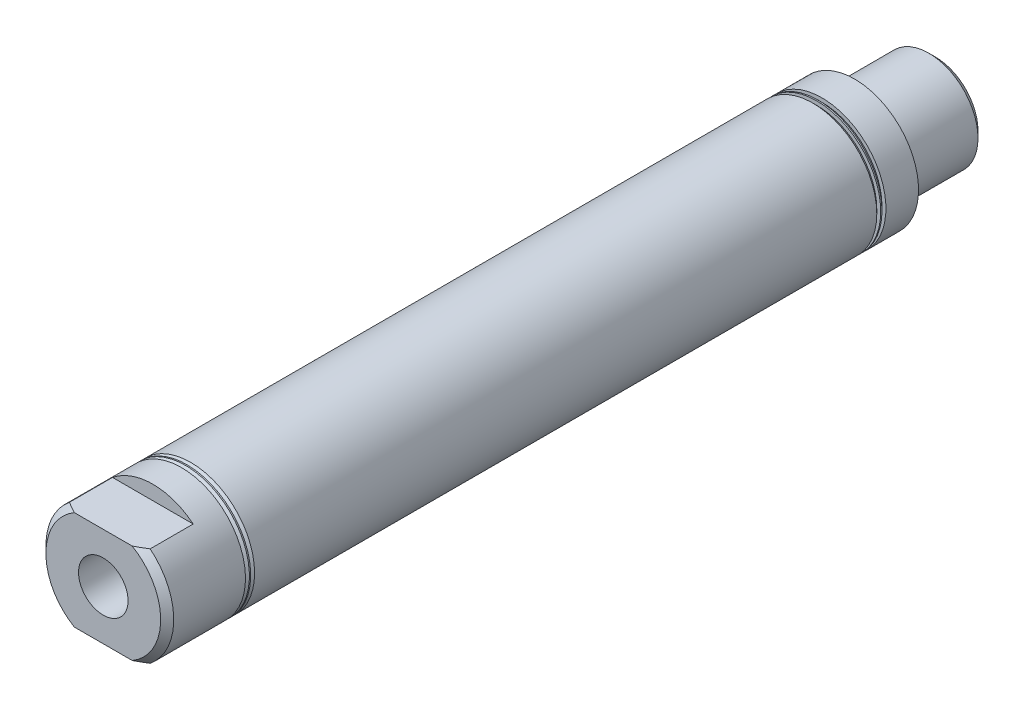
ISO-10303-21;
HEADER;
FILE_DESCRIPTION(('STEP AP214'),'2;1');
FILE_NAME('part.step','',(''),(''),'','','');
FILE_SCHEMA(('AUTOMOTIVE_DESIGN { 1 0 10303 214 1 1 1 1 }'));
ENDSEC;
DATA;
#1=APPLICATION_CONTEXT('core data for automotive mechanical design processes');
#2=APPLICATION_PROTOCOL_DEFINITION('international standard','automotive_design',2000,#1);
#3=PRODUCT_CONTEXT('',#1,'mechanical');
#4=PRODUCT('Part','Part','',(#3));
#5=PRODUCT_RELATED_PRODUCT_CATEGORY('part','',(#4));
#6=PRODUCT_DEFINITION_FORMATION('','',#4);
#7=PRODUCT_DEFINITION_CONTEXT('part definition',#1,'design');
#8=PRODUCT_DEFINITION('design','',#6,#7);
#9=PRODUCT_DEFINITION_SHAPE('','',#8);
#10=(LENGTH_UNIT() NAMED_UNIT(*) SI_UNIT(.MILLI.,.METRE.));
#11=(NAMED_UNIT(*) PLANE_ANGLE_UNIT() SI_UNIT($,.RADIAN.));
#12=(NAMED_UNIT(*) SI_UNIT($,.STERADIAN.) SOLID_ANGLE_UNIT());
#13=UNCERTAINTY_MEASURE_WITH_UNIT(LENGTH_MEASURE(1.E-05),#10,'distance_accuracy_value','');
#14=(GEOMETRIC_REPRESENTATION_CONTEXT(3) GLOBAL_UNCERTAINTY_ASSIGNED_CONTEXT((#13)) GLOBAL_UNIT_ASSIGNED_CONTEXT((#10,
#11,#12)) REPRESENTATION_CONTEXT('',''));
#15=CARTESIAN_POINT('',(0.,0.,0.));
#16=DIRECTION('',(0.,0.,1.));
#17=DIRECTION('',(1.,0.,0.));
#18=AXIS2_PLACEMENT_3D('',#15,#16,#17);
#19=CARTESIAN_POINT('',(2.0193,0.,71.374));
#20=DIRECTION('',(0.,0.,-1.));
#21=DIRECTION('',(1.,0.,0.));
#22=AXIS2_PLACEMENT_3D('',#19,#20,#21);
#23=PLANE('',#22);
#24=CARTESIAN_POINT('',(0.,0.,71.374));
#25=DIRECTION('',(0.,0.,-1.));
#26=DIRECTION('',(-1.,0.,0.));
#27=AXIS2_PLACEMENT_3D('',#24,#25,#26);
#28=CIRCLE('',#27,2.0193);
#29=CARTESIAN_POINT('',(2.0193,0.,71.374));
#30=VERTEX_POINT('',#29);
#31=EDGE_CURVE('E300',#30,#30,#28,.T.);
#32=ORIENTED_EDGE('',*,*,#31,.T.);
#33=EDGE_LOOP('',(#32));
#34=FACE_BOUND('',#33,.T.);
#35=CARTESIAN_POINT('',(0.,0.,71.374));
#36=DIRECTION('',(0.,0.,-1.));
#37=DIRECTION('',(-1.,0.,0.));
#38=AXIS2_PLACEMENT_3D('',#35,#36,#37);
#39=CIRCLE('',#38,2.413);
#40=CARTESIAN_POINT('',(2.413,0.,71.374));
#41=VERTEX_POINT('',#40);
#42=EDGE_CURVE('E297',#41,#41,#39,.T.);
#43=ORIENTED_EDGE('',*,*,#42,.F.);
#44=EDGE_LOOP('',(#43));
#45=FACE_BOUND('',#44,.T.);
#46=ADVANCED_FACE('F45',(#34,#45),#23,.F.);
#47=CARTESIAN_POINT('',(0.,0.,76.2));
#48=DIRECTION('',(0.,0.,-1.));
#49=DIRECTION('',(1.,0.,0.));
#50=AXIS2_PLACEMENT_3D('',#47,#48,#49);
#51=PLANE('',#50);
#52=CARTESIAN_POINT('',(0.,0.,76.2));
#53=DIRECTION('',(0.,0.,1.));
#54=DIRECTION('',(1.,0.,0.));
#55=AXIS2_PLACEMENT_3D('',#52,#53,#54);
#56=CIRCLE('',#55,6.223);
#57=CARTESIAN_POINT('',(-3.92879790775753,-4.826,76.2));
#58=VERTEX_POINT('',#57);
#59=CARTESIAN_POINT('',(3.92879790775753,-4.826,76.2));
#60=VERTEX_POINT('',#59);
#61=EDGE_CURVE('E282',#58,#60,#56,.T.);
#62=ORIENTED_EDGE('',*,*,#61,.T.);
#63=DIRECTION('',(-1.,0.,0.));
#64=VECTOR('',#63,1.);
#65=CARTESIAN_POINT('',(3.92879790775753,-4.826,76.2));
#66=LINE('',#65,#64);
#67=EDGE_CURVE('E11',#60,#58,#66,.T.);
#68=ORIENTED_EDGE('',*,*,#67,.T.);
#69=EDGE_LOOP('',(#62,#68));
#70=FACE_BOUND('',#69,.T.);
#71=ADVANCED_FACE('F365',(#70),#51,.F.);
#72=CARTESIAN_POINT('',(3.92879790775753,-4.826,76.2));
#73=DIRECTION('',(0.,-1.,0.));
#74=DIRECTION('',(0.,0.,1.));
#75=AXIS2_PLACEMENT_3D('',#72,#73,#74);
#76=PLANE('',#75);
#77=DIRECTION('',(0.,0.,1.));
#78=VECTOR('',#77,1.);
#79=CARTESIAN_POINT('',(3.92879790775753,-4.826,76.2));
#80=LINE('',#79,#78);
#81=CARTESIAN_POINT('',(3.92879790775753,-4.826,80.391));
#82=VERTEX_POINT('',#81);
#83=EDGE_CURVE('E235',#60,#82,#80,.T.);
#84=ORIENTED_EDGE('',*,*,#83,.T.);
#85=CARTESIAN_POINT('',(3.92879790775753,-4.826,80.3910000000005));
#86=CARTESIAN_POINT('',(3.34300994946202,-4.826,80.7608284597366));
#87=CARTESIAN_POINT('',(2.81699627262535,-4.826,81.0260000000013));
#88=(BOUNDED_CURVE() B_SPLINE_CURVE(2,(#85,#86,#87),.UNSPECIFIED.,.F.,
.F.) B_SPLINE_CURVE_WITH_KNOTS((3,3),(0.541697335186386,0.705509946676079),
.UNSPECIFIED.) CURVE() GEOMETRIC_REPRESENTATION_ITEM() RATIONAL_B_SPLINE_CURVE((1.46981627296587,
1.52071721469879,1.5594392164396)) REPRESENTATION_ITEM(''));
#89=CARTESIAN_POINT('',(2.81699627262797,-4.826,81.026));
#90=VERTEX_POINT('',#89);
#91=EDGE_CURVE('E215',#82,#90,#88,.T.);
#92=ORIENTED_EDGE('',*,*,#91,.T.);
#93=DIRECTION('',(-1.,0.,0.));
#94=VECTOR('',#93,1.);
#95=CARTESIAN_POINT('',(3.92879790775753,-4.826,81.026));
#96=LINE('',#95,#94);
#97=CARTESIAN_POINT('',(-2.81699627262797,-4.826,81.026));
#98=VERTEX_POINT('',#97);
#99=EDGE_CURVE('E225',#90,#98,#96,.T.);
#100=ORIENTED_EDGE('',*,*,#99,.T.);
#101=CARTESIAN_POINT('',(-2.81699627262537,-4.826,81.0260000000013));
#102=CARTESIAN_POINT('',(-3.3430099495075,-4.826,80.7608284597136));
#103=CARTESIAN_POINT('',(-3.92879790785972,-4.826,80.3909999999354));
#104=(BOUNDED_CURVE() B_SPLINE_CURVE(2,(#101,#102,#103),.UNSPECIFIED.,.F.,
.F.) B_SPLINE_CURVE_WITH_KNOTS((3,3),(1.74716911100756,1.91098172248345),
.UNSPECIFIED.) CURVE() GEOMETRIC_REPRESENTATION_ITEM() RATIONAL_B_SPLINE_CURVE((1.5594392164396,
1.52071721469553,1.46981627295729)) REPRESENTATION_ITEM(''));
#105=CARTESIAN_POINT('',(-3.92879790775753,-4.826,80.391));
#106=VERTEX_POINT('',#105);
#107=EDGE_CURVE('E272',#98,#106,#104,.T.);
#108=ORIENTED_EDGE('',*,*,#107,.T.);
#109=DIRECTION('',(0.,0.,1.));
#110=VECTOR('',#109,1.);
#111=CARTESIAN_POINT('',(-3.92879790775753,-4.826,76.2));
#112=LINE('',#111,#110);
#113=EDGE_CURVE('E244',#58,#106,#112,.T.);
#114=ORIENTED_EDGE('',*,*,#113,.F.);
#115=ORIENTED_EDGE('',*,*,#67,.F.);
#116=EDGE_LOOP('',(#84,#92,#100,#108,#114,#115));
#117=FACE_BOUND('',#116,.T.);
#118=ADVANCED_FACE('F232',(#117),#76,.T.);
#119=CARTESIAN_POINT('',(0.,0.,76.2));
#120=DIRECTION('',(0.,0.,-1.));
#121=DIRECTION('',(1.,0.,0.));
#122=AXIS2_PLACEMENT_3D('',#119,#120,#121);
#123=PLANE('',#122);
#124=CARTESIAN_POINT('',(0.,0.,76.2));
#125=DIRECTION('',(0.,0.,1.));
#126=DIRECTION('',(1.,0.,0.));
#127=AXIS2_PLACEMENT_3D('',#124,#125,#126);
#128=CIRCLE('',#127,6.223);
#129=CARTESIAN_POINT('',(3.92879790775753,4.826,76.2));
#130=VERTEX_POINT('',#129);
#131=CARTESIAN_POINT('',(-3.92879790775753,4.826,76.2));
#132=VERTEX_POINT('',#131);
#133=EDGE_CURVE('E260',#130,#132,#128,.T.);
#134=ORIENTED_EDGE('',*,*,#133,.T.);
#135=DIRECTION('',(1.,0.,0.));
#136=VECTOR('',#135,1.);
#137=CARTESIAN_POINT('',(3.92879790775753,4.826,76.2));
#138=LINE('',#137,#136);
#139=EDGE_CURVE('E49',#132,#130,#138,.T.);
#140=ORIENTED_EDGE('',*,*,#139,.T.);
#141=EDGE_LOOP('',(#134,#140));
#142=FACE_BOUND('',#141,.T.);
#143=ADVANCED_FACE('F381',(#142),#123,.F.);
#144=CARTESIAN_POINT('',(3.92879790775753,4.826,76.2));
#145=DIRECTION('',(0.,1.,0.));
#146=DIRECTION('',(1.,0.,0.));
#147=AXIS2_PLACEMENT_3D('',#144,#145,#146);
#148=PLANE('',#147);
#149=DIRECTION('',(0.,0.,1.));
#150=VECTOR('',#149,1.);
#151=CARTESIAN_POINT('',(-3.92879790775753,4.826,76.2));
#152=LINE('',#151,#150);
#153=CARTESIAN_POINT('',(-3.92879790775753,4.826,80.391));
#154=VERTEX_POINT('',#153);
#155=EDGE_CURVE('E254',#132,#154,#152,.T.);
#156=ORIENTED_EDGE('',*,*,#155,.T.);
#157=CARTESIAN_POINT('',(-3.92879790775753,4.826,80.3910000000005));
#158=CARTESIAN_POINT('',(-3.34300994946202,4.826,80.7608284597366));
#159=CARTESIAN_POINT('',(-2.81699627262536,4.826,81.0260000000013));
#160=(BOUNDED_CURVE() B_SPLINE_CURVE(2,(#157,#158,#159),.UNSPECIFIED.,.F.,
.F.) B_SPLINE_CURVE_WITH_KNOTS((3,3),(0.541697335186386,0.705509946676081),
.UNSPECIFIED.) CURVE() GEOMETRIC_REPRESENTATION_ITEM() RATIONAL_B_SPLINE_CURVE((1.46981627296587,
1.52071721469879,1.5594392164396)) REPRESENTATION_ITEM(''));
#161=CARTESIAN_POINT('',(-2.81699627262797,4.826,81.026));
#162=VERTEX_POINT('',#161);
#163=EDGE_CURVE('E266',#154,#162,#160,.T.);
#164=ORIENTED_EDGE('',*,*,#163,.T.);
#165=DIRECTION('',(1.,0.,0.));
#166=VECTOR('',#165,1.);
#167=CARTESIAN_POINT('',(3.92879790775753,4.826,81.026));
#168=LINE('',#167,#166);
#169=CARTESIAN_POINT('',(2.81699627262797,4.826,81.026));
#170=VERTEX_POINT('',#169);
#171=EDGE_CURVE('E291',#162,#170,#168,.T.);
#172=ORIENTED_EDGE('',*,*,#171,.T.);
#173=CARTESIAN_POINT('',(2.81699627262543,4.826,81.0260000000013));
#174=CARTESIAN_POINT('',(3.34300994950755,4.826,80.7608284597136));
#175=CARTESIAN_POINT('',(3.92879790785974,4.826,80.3909999999354));
#176=(BOUNDED_CURVE() B_SPLINE_CURVE(2,(#173,#174,#175),.UNSPECIFIED.,.F.,
.F.) B_SPLINE_CURVE_WITH_KNOTS((3,3),(1.74716911100756,1.91098172248345),
.UNSPECIFIED.) CURVE() GEOMETRIC_REPRESENTATION_ITEM() RATIONAL_B_SPLINE_CURVE((1.55943921643959,
1.52071721469552,1.46981627295729)) REPRESENTATION_ITEM(''));
#177=CARTESIAN_POINT('',(3.92879790775754,4.826,80.391));
#178=VERTEX_POINT('',#177);
#179=EDGE_CURVE('E218',#170,#178,#176,.T.);
#180=ORIENTED_EDGE('',*,*,#179,.T.);
#181=DIRECTION('',(0.,0.,1.));
#182=VECTOR('',#181,1.);
#183=CARTESIAN_POINT('',(3.92879790775753,4.826,76.2));
#184=LINE('',#183,#182);
#185=EDGE_CURVE('E273',#130,#178,#184,.T.);
#186=ORIENTED_EDGE('',*,*,#185,.F.);
#187=ORIENTED_EDGE('',*,*,#139,.F.);
#188=EDGE_LOOP('',(#156,#164,#172,#180,#186,#187));
#189=FACE_BOUND('',#188,.T.);
#190=ADVANCED_FACE('F390',(#189),#148,.T.);
#191=CARTESIAN_POINT('',(0.,6.223,73.406));
#192=DIRECTION('',(0.,0.,-1.));
#193=DIRECTION('',(1.,0.,0.));
#194=AXIS2_PLACEMENT_3D('',#191,#192,#193);
#195=PLANE('',#194);
#196=CARTESIAN_POINT('',(0.,0.,73.406));
#197=DIRECTION('',(0.,0.,1.));
#198=DIRECTION('',(1.,0.,0.));
#199=AXIS2_PLACEMENT_3D('',#196,#197,#198);
#200=CIRCLE('',#199,5.842);
#201=CARTESIAN_POINT('',(-5.842,0.,73.406));
#202=VERTEX_POINT('',#201);
#203=EDGE_CURVE('E344',#202,#202,#200,.T.);
#204=ORIENTED_EDGE('',*,*,#203,.T.);
#205=EDGE_LOOP('',(#204));
#206=FACE_BOUND('',#205,.T.);
#207=CARTESIAN_POINT('',(0.,0.,73.406));
#208=DIRECTION('',(0.,0.,1.));
#209=DIRECTION('',(1.,0.,0.));
#210=AXIS2_PLACEMENT_3D('',#207,#208,#209);
#211=CIRCLE('',#210,6.223);
#212=CARTESIAN_POINT('',(-6.223,0.,73.406));
#213=VERTEX_POINT('',#212);
#214=EDGE_CURVE('E230',#213,#213,#211,.T.);
#215=ORIENTED_EDGE('',*,*,#214,.F.);
#216=EDGE_LOOP('',(#215));
#217=FACE_BOUND('',#216,.T.);
#218=ADVANCED_FACE('F47',(#206,#217),#195,.T.);
#219=CARTESIAN_POINT('',(0.,6.223,72.898));
#220=DIRECTION('',(0.,0.,-1.));
#221=DIRECTION('',(1.,0.,0.));
#222=AXIS2_PLACEMENT_3D('',#219,#220,#221);
#223=PLANE('',#222);
#224=CARTESIAN_POINT('',(0.,0.,72.898));
#225=DIRECTION('',(0.,0.,1.));
#226=DIRECTION('',(1.,0.,0.));
#227=AXIS2_PLACEMENT_3D('',#224,#225,#226);
#228=CIRCLE('',#227,5.842);
#229=CARTESIAN_POINT('',(-5.842,0.,72.898));
#230=VERTEX_POINT('',#229);
#231=EDGE_CURVE('E284',#230,#230,#228,.T.);
#232=ORIENTED_EDGE('',*,*,#231,.T.);
#233=EDGE_LOOP('',(#232));
#234=FACE_BOUND('',#233,.T.);
#235=CARTESIAN_POINT('',(0.,0.,72.898));
#236=DIRECTION('',(0.,0.,1.));
#237=DIRECTION('',(1.,0.,0.));
#238=AXIS2_PLACEMENT_3D('',#235,#236,#237);
#239=CIRCLE('',#238,6.223);
#240=CARTESIAN_POINT('',(-6.223,0.,72.898));
#241=VERTEX_POINT('',#240);
#242=EDGE_CURVE('E222',#241,#241,#239,.T.);
#243=ORIENTED_EDGE('',*,*,#242,.F.);
#244=EDGE_LOOP('',(#243));
#245=FACE_BOUND('',#244,.T.);
#246=ADVANCED_FACE('F486',(#234,#245),#223,.T.);
#247=CARTESIAN_POINT('',(0.,5.55625,25.4));
#248=DIRECTION('',(0.,0.,-1.));
#249=DIRECTION('',(1.,0.,0.));
#250=AXIS2_PLACEMENT_3D('',#247,#248,#249);
#251=PLANE('',#250);
#252=CARTESIAN_POINT('',(0.,0.,25.4));
#253=DIRECTION('',(0.,0.,-1.));
#254=DIRECTION('',(-1.,0.,0.));
#255=AXIS2_PLACEMENT_3D('',#252,#253,#254);
#256=CIRCLE('',#255,2.3749);
#257=CARTESIAN_POINT('',(2.3749,0.,25.4));
#258=VERTEX_POINT('',#257);
#259=EDGE_CURVE('E425',#258,#258,#256,.T.);
#260=ORIENTED_EDGE('',*,*,#259,.T.);
#261=EDGE_LOOP('',(#260));
#262=FACE_BOUND('',#261,.T.);
#263=CARTESIAN_POINT('',(0.,0.,25.4));
#264=DIRECTION('',(0.,0.,-1.));
#265=DIRECTION('',(-1.,0.,0.));
#266=AXIS2_PLACEMENT_3D('',#263,#264,#265);
#267=CIRCLE('',#266,5.55625);
#268=CARTESIAN_POINT('',(5.55625,0.,25.4));
#269=VERTEX_POINT('',#268);
#270=EDGE_CURVE('E265',#269,#269,#267,.T.);
#271=ORIENTED_EDGE('',*,*,#270,.F.);
#272=EDGE_LOOP('',(#271));
#273=FACE_BOUND('',#272,.T.);
#274=ADVANCED_FACE('F478',(#262,#273),#251,.F.);
#275=CARTESIAN_POINT('',(0.,0.,63.5));
#276=DIRECTION('',(0.,0.,1.));
#277=DIRECTION('',(0.,-1.,0.));
#278=AXIS2_PLACEMENT_3D('',#275,#276,#277);
#279=PLANE('',#278);
#280=CARTESIAN_POINT('',(0.,0.,63.5));
#281=DIRECTION('',(0.,0.,-1.));
#282=DIRECTION('',(-1.,0.,0.));
#283=AXIS2_PLACEMENT_3D('',#280,#281,#282);
#284=CIRCLE('',#283,5.55625);
#285=CARTESIAN_POINT('',(5.55625,0.,63.5));
#286=VERTEX_POINT('',#285);
#287=EDGE_CURVE('E314',#286,#286,#284,.T.);
#288=ORIENTED_EDGE('',*,*,#287,.T.);
#289=EDGE_LOOP('',(#288));
#290=FACE_BOUND('',#289,.T.);
#291=ADVANCED_FACE('F476',(#290),#279,.F.);
#292=CARTESIAN_POINT('',(0.,6.223,11.557));
#293=DIRECTION('',(0.,0.,1.));
#294=DIRECTION('',(0.,-1.,0.));
#295=AXIS2_PLACEMENT_3D('',#292,#293,#294);
#296=PLANE('',#295);
#297=CARTESIAN_POINT('',(0.,0.,11.557));
#298=DIRECTION('',(0.,0.,1.));
#299=DIRECTION('',(1.,0.,0.));
#300=AXIS2_PLACEMENT_3D('',#297,#298,#299);
#301=CIRCLE('',#300,5.842);
#302=CARTESIAN_POINT('',(5.842,0.,11.557));
#303=VERTEX_POINT('',#302);
#304=EDGE_CURVE('E261',#303,#303,#301,.T.);
#305=ORIENTED_EDGE('',*,*,#304,.F.);
#306=EDGE_LOOP('',(#305));
#307=FACE_BOUND('',#306,.T.);
#308=CARTESIAN_POINT('',(0.,0.,11.557));
#309=DIRECTION('',(0.,0.,1.));
#310=DIRECTION('',(1.,0.,0.));
#311=AXIS2_PLACEMENT_3D('',#308,#309,#310);
#312=CIRCLE('',#311,6.223);
#313=CARTESIAN_POINT('',(-6.223,0.,11.557));
#314=VERTEX_POINT('',#313);
#315=EDGE_CURVE('E252',#314,#314,#312,.T.);
#316=ORIENTED_EDGE('',*,*,#315,.T.);
#317=EDGE_LOOP('',(#316));
#318=FACE_BOUND('',#317,.T.);
#319=ADVANCED_FACE('F405',(#307,#318),#296,.T.);
#320=CARTESIAN_POINT('',(0.,6.223,11.049));
#321=DIRECTION('',(0.,0.,1.));
#322=DIRECTION('',(0.,-1.,0.));
#323=AXIS2_PLACEMENT_3D('',#320,#321,#322);
#324=PLANE('',#323);
#325=CARTESIAN_POINT('',(0.,0.,11.049));
#326=DIRECTION('',(0.,0.,1.));
#327=DIRECTION('',(1.,0.,0.));
#328=AXIS2_PLACEMENT_3D('',#325,#326,#327);
#329=CIRCLE('',#328,5.842);
#330=CARTESIAN_POINT('',(5.842,0.,11.049));
#331=VERTEX_POINT('',#330);
#332=EDGE_CURVE('E296',#331,#331,#329,.T.);
#333=ORIENTED_EDGE('',*,*,#332,.F.);
#334=EDGE_LOOP('',(#333));
#335=FACE_BOUND('',#334,.T.);
#336=CARTESIAN_POINT('',(0.,0.,11.049));
#337=DIRECTION('',(0.,0.,1.));
#338=DIRECTION('',(1.,0.,0.));
#339=AXIS2_PLACEMENT_3D('',#336,#337,#338);
#340=CIRCLE('',#339,6.223);
#341=CARTESIAN_POINT('',(-6.223,0.,11.049));
#342=VERTEX_POINT('',#341);
#343=EDGE_CURVE('E311',#342,#342,#340,.T.);
#344=ORIENTED_EDGE('',*,*,#343,.T.);
#345=EDGE_LOOP('',(#344));
#346=FACE_BOUND('',#345,.T.);
#347=ADVANCED_FACE('F397',(#335,#346),#324,.T.);
#348=CARTESIAN_POINT('',(0.,4.7752,0.));
#349=DIRECTION('',(0.,0.,1.));
#350=DIRECTION('',(0.,-1.,0.));
#351=AXIS2_PLACEMENT_3D('',#348,#349,#350);
#352=PLANE('',#351);
#353=CARTESIAN_POINT('',(0.,0.,0.));
#354=DIRECTION('',(0.,0.,-1.));
#355=DIRECTION('',(-1.,0.,0.));
#356=AXIS2_PLACEMENT_3D('',#353,#354,#355);
#357=CIRCLE('',#356,2.3749);
#358=CARTESIAN_POINT('',(2.3749,0.,0.));
#359=VERTEX_POINT('',#358);
#360=EDGE_CURVE('E341',#359,#359,#357,.T.);
#361=ORIENTED_EDGE('',*,*,#360,.F.);
#362=EDGE_LOOP('',(#361));
#363=FACE_BOUND('',#362,.T.);
#364=CARTESIAN_POINT('',(0.,0.,0.));
#365=DIRECTION('',(0.,0.,1.));
#366=DIRECTION('',(-1.,0.,0.));
#367=AXIS2_PLACEMENT_3D('',#364,#365,#366);
#368=CIRCLE('',#367,4.1402);
#369=CARTESIAN_POINT('',(4.1402,0.,0.));
#370=VERTEX_POINT('',#369);
#371=EDGE_CURVE('E307',#370,#370,#368,.T.);
#372=ORIENTED_EDGE('',*,*,#371,.F.);
#373=EDGE_LOOP('',(#372));
#374=FACE_BOUND('',#373,.T.);
#375=ADVANCED_FACE('F394',(#363,#374),#352,.F.);
#376=CARTESIAN_POINT('',(0.,6.223,7.874));
#377=DIRECTION('',(0.,0.,1.));
#378=DIRECTION('',(0.,-1.,0.));
#379=AXIS2_PLACEMENT_3D('',#376,#377,#378);
#380=PLANE('',#379);
#381=CARTESIAN_POINT('',(0.,0.,7.874));
#382=DIRECTION('',(0.,0.,1.));
#383=DIRECTION('',(1.,0.,0.));
#384=AXIS2_PLACEMENT_3D('',#381,#382,#383);
#385=CIRCLE('',#384,4.7752);
#386=CARTESIAN_POINT('',(-4.7752,0.,7.874));
#387=VERTEX_POINT('',#386);
#388=EDGE_CURVE('E295',#387,#387,#385,.T.);
#389=ORIENTED_EDGE('',*,*,#388,.T.);
#390=EDGE_LOOP('',(#389));
#391=FACE_BOUND('',#390,.T.);
#392=CARTESIAN_POINT('',(0.,0.,7.874));
#393=DIRECTION('',(0.,0.,1.));
#394=DIRECTION('',(1.,0.,0.));
#395=AXIS2_PLACEMENT_3D('',#392,#393,#394);
#396=CIRCLE('',#395,6.223);
#397=CARTESIAN_POINT('',(-6.223,0.,7.874));
#398=VERTEX_POINT('',#397);
#399=EDGE_CURVE('E308',#398,#398,#396,.T.);
#400=ORIENTED_EDGE('',*,*,#399,.F.);
#401=EDGE_LOOP('',(#400));
#402=FACE_BOUND('',#401,.T.);
#403=ADVANCED_FACE('F396',(#391,#402),#380,.F.);
#404=CARTESIAN_POINT('',(0.,0.,80.391));
#405=DIRECTION('',(0.,0.,-1.));
#406=DIRECTION('',(-1.,0.,0.));
#407=AXIS2_PLACEMENT_3D('',#404,#405,#406);
#408=CONICAL_SURFACE('',#407,6.223,0.785398163397447);
#409=CARTESIAN_POINT('',(0.,0.,81.026));
#410=DIRECTION('',(0.,0.,-1.));
#411=DIRECTION('',(1.,0.,0.));
#412=AXIS2_PLACEMENT_3D('',#409,#410,#411);
#413=CIRCLE('',#412,5.588);
#414=EDGE_CURVE('E67',#98,#162,#413,.T.);
#415=ORIENTED_EDGE('',*,*,#414,.T.);
#416=ORIENTED_EDGE('',*,*,#163,.F.);
#417=CARTESIAN_POINT('',(0.,0.,80.391));
#418=DIRECTION('',(0.,0.,1.));
#419=DIRECTION('',(1.,0.,0.));
#420=AXIS2_PLACEMENT_3D('',#417,#418,#419);
#421=CIRCLE('',#420,6.223);
#422=EDGE_CURVE('E237',#154,#106,#421,.T.);
#423=ORIENTED_EDGE('',*,*,#422,.T.);
#424=ORIENTED_EDGE('',*,*,#107,.F.);
#425=EDGE_LOOP('',(#415,#416,#423,#424));
#426=FACE_BOUND('',#425,.T.);
#427=ADVANCED_FACE('F393',(#426),#408,.T.);
#428=CARTESIAN_POINT('',(0.,0.,81.026));
#429=DIRECTION('',(0.,0.,-1.));
#430=DIRECTION('',(1.,0.,0.));
#431=AXIS2_PLACEMENT_3D('',#428,#429,#430);
#432=PLANE('',#431);
#433=CARTESIAN_POINT('',(0.,0.,81.026));
#434=DIRECTION('',(0.,0.,-1.));
#435=DIRECTION('',(-1.,0.,0.));
#436=AXIS2_PLACEMENT_3D('',#433,#434,#435);
#437=CIRCLE('',#436,2.413);
#438=CARTESIAN_POINT('',(2.413,0.,81.026));
#439=VERTEX_POINT('',#438);
#440=EDGE_CURVE('E301',#439,#439,#437,.T.);
#441=ORIENTED_EDGE('',*,*,#440,.T.);
#442=EDGE_LOOP('',(#441));
#443=FACE_BOUND('',#442,.T.);
#444=ORIENTED_EDGE('',*,*,#99,.F.);
#445=CARTESIAN_POINT('',(0.,0.,81.026));
#446=DIRECTION('',(0.,0.,-1.));
#447=DIRECTION('',(1.,0.,0.));
#448=AXIS2_PLACEMENT_3D('',#445,#446,#447);
#449=CIRCLE('',#448,5.588);
#450=EDGE_CURVE('E211',#170,#90,#449,.T.);
#451=ORIENTED_EDGE('',*,*,#450,.F.);
#452=ORIENTED_EDGE('',*,*,#171,.F.);
#453=ORIENTED_EDGE('',*,*,#414,.F.);
#454=EDGE_LOOP('',(#444,#451,#452,#453));
#455=FACE_BOUND('',#454,.T.);
#456=ADVANCED_FACE('F226',(#443,#455),#432,.F.);
#457=CARTESIAN_POINT('',(0.,0.,-21.4174471685587));
#458=DIRECTION('',(0.,0.,-1.));
#459=DIRECTION('',(1.,0.,0.));
#460=AXIS2_PLACEMENT_3D('',#457,#458,#459);
#461=CYLINDRICAL_SURFACE('',#460,6.223);
#462=ORIENTED_EDGE('',*,*,#214,.T.);
#463=EDGE_LOOP('',(#462));
#464=FACE_BOUND('',#463,.T.);
#465=ORIENTED_EDGE('',*,*,#422,.F.);
#466=ORIENTED_EDGE('',*,*,#155,.F.);
#467=ORIENTED_EDGE('',*,*,#133,.F.);
#468=ORIENTED_EDGE('',*,*,#185,.T.);
#469=CARTESIAN_POINT('',(0.,0.,80.391));
#470=DIRECTION('',(0.,0.,1.));
#471=DIRECTION('',(1.,0.,0.));
#472=AXIS2_PLACEMENT_3D('',#469,#470,#471);
#473=CIRCLE('',#472,6.223);
#474=EDGE_CURVE('E238',#82,#178,#473,.T.);
#475=ORIENTED_EDGE('',*,*,#474,.F.);
#476=ORIENTED_EDGE('',*,*,#83,.F.);
#477=ORIENTED_EDGE('',*,*,#61,.F.);
#478=ORIENTED_EDGE('',*,*,#113,.T.);
#479=EDGE_LOOP('',(#465,#466,#467,#468,#475,#476,#477,#478));
#480=FACE_BOUND('',#479,.T.);
#481=ADVANCED_FACE('F378',(#464,#480),#461,.T.);
#482=CARTESIAN_POINT('',(0.,0.,80.391));
#483=DIRECTION('',(0.,0.,-1.));
#484=DIRECTION('',(1.,0.,0.));
#485=AXIS2_PLACEMENT_3D('',#482,#483,#484);
#486=CONICAL_SURFACE('',#485,6.223,0.785398163397447);
#487=ORIENTED_EDGE('',*,*,#450,.T.);
#488=ORIENTED_EDGE('',*,*,#91,.F.);
#489=ORIENTED_EDGE('',*,*,#474,.T.);
#490=ORIENTED_EDGE('',*,*,#179,.F.);
#491=EDGE_LOOP('',(#487,#488,#489,#490));
#492=FACE_BOUND('',#491,.T.);
#493=ADVANCED_FACE('F213',(#492),#486,.T.);
#494=CARTESIAN_POINT('',(0.,0.,-21.4174471685587));
#495=DIRECTION('',(0.,0.,-1.));
#496=DIRECTION('',(1.,0.,0.));
#497=AXIS2_PLACEMENT_3D('',#494,#495,#496);
#498=CYLINDRICAL_SURFACE('',#497,6.223);
#499=ORIENTED_EDGE('',*,*,#242,.T.);
#500=EDGE_LOOP('',(#499));
#501=FACE_BOUND('',#500,.T.);
#502=CARTESIAN_POINT('',(0.,0.,73.025));
#503=DIRECTION('',(0.,0.,1.));
#504=DIRECTION('',(1.,0.,0.));
#505=AXIS2_PLACEMENT_3D('',#502,#503,#504);
#506=CIRCLE('',#505,6.223);
#507=CARTESIAN_POINT('',(-6.223,0.,73.025));
#508=VERTEX_POINT('',#507);
#509=EDGE_CURVE('E288',#508,#508,#506,.T.);
#510=ORIENTED_EDGE('',*,*,#509,.F.);
#511=EDGE_LOOP('',(#510));
#512=FACE_BOUND('',#511,.T.);
#513=ADVANCED_FACE('F377',(#501,#512),#498,.T.);
#514=CARTESIAN_POINT('',(0.,0.,-21.4174471685587));
#515=DIRECTION('',(0.,0.,-1.));
#516=DIRECTION('',(1.,0.,0.));
#517=AXIS2_PLACEMENT_3D('',#514,#515,#516);
#518=CYLINDRICAL_SURFACE('',#517,6.223);
#519=CARTESIAN_POINT('',(0.,0.,11.938));
#520=DIRECTION('',(0.,0.,1.));
#521=DIRECTION('',(1.,0.,0.));
#522=AXIS2_PLACEMENT_3D('',#519,#520,#521);
#523=CIRCLE('',#522,6.223);
#524=CARTESIAN_POINT('',(6.223,0.,11.938));
#525=VERTEX_POINT('',#524);
#526=EDGE_CURVE('E264',#525,#525,#523,.T.);
#527=ORIENTED_EDGE('',*,*,#526,.T.);
#528=EDGE_LOOP('',(#527));
#529=FACE_BOUND('',#528,.T.);
#530=CARTESIAN_POINT('',(0.,0.,72.517));
#531=DIRECTION('',(0.,0.,1.));
#532=DIRECTION('',(1.,0.,0.));
#533=AXIS2_PLACEMENT_3D('',#530,#531,#532);
#534=CIRCLE('',#533,6.223);
#535=CARTESIAN_POINT('',(-6.223,0.,72.517));
#536=VERTEX_POINT('',#535);
#537=EDGE_CURVE('E287',#536,#536,#534,.T.);
#538=ORIENTED_EDGE('',*,*,#537,.F.);
#539=EDGE_LOOP('',(#538));
#540=FACE_BOUND('',#539,.T.);
#541=ADVANCED_FACE('F504',(#529,#540),#518,.T.);
#542=CARTESIAN_POINT('',(0.,0.,-21.4174471685587));
#543=DIRECTION('',(0.,0.,-1.));
#544=DIRECTION('',(1.,0.,0.));
#545=AXIS2_PLACEMENT_3D('',#542,#543,#544);
#546=CYLINDRICAL_SURFACE('',#545,6.223);
#547=CARTESIAN_POINT('',(0.,0.,11.43));
#548=DIRECTION('',(0.,0.,1.));
#549=DIRECTION('',(1.,0.,0.));
#550=AXIS2_PLACEMENT_3D('',#547,#548,#549);
#551=CIRCLE('',#550,6.223);
#552=CARTESIAN_POINT('',(6.223,0.,11.43));
#553=VERTEX_POINT('',#552);
#554=EDGE_CURVE('E292',#553,#553,#551,.T.);
#555=ORIENTED_EDGE('',*,*,#554,.T.);
#556=EDGE_LOOP('',(#555));
#557=FACE_BOUND('',#556,.T.);
#558=ORIENTED_EDGE('',*,*,#315,.F.);
#559=EDGE_LOOP('',(#558));
#560=FACE_BOUND('',#559,.T.);
#561=ADVANCED_FACE('F512',(#557,#560),#546,.T.);
#562=CARTESIAN_POINT('',(0.,0.,-21.4174471685587));
#563=DIRECTION('',(0.,0.,-1.));
#564=DIRECTION('',(1.,0.,0.));
#565=AXIS2_PLACEMENT_3D('',#562,#563,#564);
#566=CYLINDRICAL_SURFACE('',#565,6.223);
#567=ORIENTED_EDGE('',*,*,#399,.T.);
#568=EDGE_LOOP('',(#567));
#569=FACE_BOUND('',#568,.T.);
#570=ORIENTED_EDGE('',*,*,#343,.F.);
#571=EDGE_LOOP('',(#570));
#572=FACE_BOUND('',#571,.T.);
#573=ADVANCED_FACE('F386',(#569,#572),#566,.T.);
#574=CARTESIAN_POINT('',(0.,0.,-21.4174471685587));
#575=DIRECTION('',(0.,0.,-1.));
#576=DIRECTION('',(1.,0.,0.));
#577=AXIS2_PLACEMENT_3D('',#574,#575,#576);
#578=CYLINDRICAL_SURFACE('',#577,4.7752);
#579=CARTESIAN_POINT('',(0.,0.,0.635));
#580=DIRECTION('',(0.,0.,-1.));
#581=DIRECTION('',(-1.,0.,0.));
#582=AXIS2_PLACEMENT_3D('',#579,#580,#581);
#583=CIRCLE('',#582,4.7752);
#584=CARTESIAN_POINT('',(4.7752,0.,0.635));
#585=VERTEX_POINT('',#584);
#586=EDGE_CURVE('E342',#585,#585,#583,.T.);
#587=ORIENTED_EDGE('',*,*,#586,.F.);
#588=EDGE_LOOP('',(#587));
#589=FACE_BOUND('',#588,.T.);
#590=ORIENTED_EDGE('',*,*,#388,.F.);
#591=EDGE_LOOP('',(#590));
#592=FACE_BOUND('',#591,.T.);
#593=ADVANCED_FACE('F382',(#589,#592),#578,.T.);
#594=CARTESIAN_POINT('',(0.,0.,11.049));
#595=DIRECTION('',(0.,0.,1.));
#596=DIRECTION('',(-1.,0.,0.));
#597=AXIS2_PLACEMENT_3D('',#594,#595,#596);
#598=CONICAL_SURFACE('',#597,5.842,0.78539816339745);
#599=ORIENTED_EDGE('',*,*,#554,.F.);
#600=EDGE_LOOP('',(#599));
#601=FACE_BOUND('',#600,.T.);
#602=ORIENTED_EDGE('',*,*,#332,.T.);
#603=EDGE_LOOP('',(#602));
#604=FACE_BOUND('',#603,.T.);
#605=ADVANCED_FACE('F385',(#601,#604),#598,.T.);
#606=CARTESIAN_POINT('',(0.,0.,11.557));
#607=DIRECTION('',(0.,0.,1.));
#608=DIRECTION('',(-1.,0.,0.));
#609=AXIS2_PLACEMENT_3D('',#606,#607,#608);
#610=CONICAL_SURFACE('',#609,5.842,0.785398163397448);
#611=ORIENTED_EDGE('',*,*,#526,.F.);
#612=EDGE_LOOP('',(#611));
#613=FACE_BOUND('',#612,.T.);
#614=ORIENTED_EDGE('',*,*,#304,.T.);
#615=EDGE_LOOP('',(#614));
#616=FACE_BOUND('',#615,.T.);
#617=ADVANCED_FACE('F473',(#613,#616),#610,.T.);
#618=CARTESIAN_POINT('',(0.,0.,0.));
#619=DIRECTION('',(0.,0.,1.));
#620=DIRECTION('',(-1.,0.,0.));
#621=AXIS2_PLACEMENT_3D('',#618,#619,#620);
#622=CYLINDRICAL_SURFACE('',#621,5.55625);
#623=ORIENTED_EDGE('',*,*,#270,.T.);
#624=EDGE_LOOP('',(#623));
#625=FACE_BOUND('',#624,.T.);
#626=ORIENTED_EDGE('',*,*,#287,.F.);
#627=EDGE_LOOP('',(#626));
#628=FACE_BOUND('',#627,.T.);
#629=ADVANCED_FACE('F508',(#625,#628),#622,.F.);
#630=CARTESIAN_POINT('',(0.,0.,0.));
#631=DIRECTION('',(0.,0.,1.));
#632=DIRECTION('',(-1.,0.,0.));
#633=AXIS2_PLACEMENT_3D('',#630,#631,#632);
#634=CYLINDRICAL_SURFACE('',#633,2.3749);
#635=ORIENTED_EDGE('',*,*,#360,.T.);
#636=EDGE_LOOP('',(#635));
#637=FACE_BOUND('',#636,.T.);
#638=ORIENTED_EDGE('',*,*,#259,.F.);
#639=EDGE_LOOP('',(#638));
#640=FACE_BOUND('',#639,.T.);
#641=ADVANCED_FACE('F468',(#637,#640),#634,.F.);
#642=CARTESIAN_POINT('',(0.,0.,72.517));
#643=DIRECTION('',(0.,0.,-1.));
#644=DIRECTION('',(1.,0.,0.));
#645=AXIS2_PLACEMENT_3D('',#642,#643,#644);
#646=CONICAL_SURFACE('',#645,6.223,0.785398163397466);
#647=ORIENTED_EDGE('',*,*,#537,.T.);
#648=EDGE_LOOP('',(#647));
#649=FACE_BOUND('',#648,.T.);
#650=ORIENTED_EDGE('',*,*,#231,.F.);
#651=EDGE_LOOP('',(#650));
#652=FACE_BOUND('',#651,.T.);
#653=ADVANCED_FACE('F459',(#649,#652),#646,.T.);
#654=CARTESIAN_POINT('',(0.,0.,73.025));
#655=DIRECTION('',(0.,0.,-1.));
#656=DIRECTION('',(1.,0.,0.));
#657=AXIS2_PLACEMENT_3D('',#654,#655,#656);
#658=CONICAL_SURFACE('',#657,6.223,0.785398163397448);
#659=ORIENTED_EDGE('',*,*,#509,.T.);
#660=EDGE_LOOP('',(#659));
#661=FACE_BOUND('',#660,.T.);
#662=ORIENTED_EDGE('',*,*,#203,.F.);
#663=EDGE_LOOP('',(#662));
#664=FACE_BOUND('',#663,.T.);
#665=ADVANCED_FACE('F456',(#661,#664),#658,.T.);
#666=CARTESIAN_POINT('',(0.,0.,0.));
#667=DIRECTION('',(0.,0.,1.));
#668=DIRECTION('',(-1.,0.,0.));
#669=AXIS2_PLACEMENT_3D('',#666,#667,#668);
#670=CONICAL_SURFACE('',#669,4.1402,0.785398163397448);
#671=ORIENTED_EDGE('',*,*,#586,.T.);
#672=EDGE_LOOP('',(#671));
#673=FACE_BOUND('',#672,.T.);
#674=ORIENTED_EDGE('',*,*,#371,.T.);
#675=EDGE_LOOP('',(#674));
#676=FACE_BOUND('',#675,.T.);
#677=ADVANCED_FACE('F458',(#673,#676),#670,.T.);
#678=CARTESIAN_POINT('',(0.,0.,67.4120064));
#679=DIRECTION('',(0.,0.,1.));
#680=DIRECTION('',(-1.,0.,0.));
#681=AXIS2_PLACEMENT_3D('',#678,#679,#680);
#682=CONICAL_SURFACE('',#681,2.0193,1.02974425867665);
#683=CARTESIAN_POINT('',(0.,0.,66.1986885519977));
#684=VERTEX_POINT('',#683);
#685=VERTEX_LOOP('',#684);
#686=FACE_BOUND('',#685,.T.);
#687=CARTESIAN_POINT('',(0.,0.,67.4120064));
#688=DIRECTION('',(0.,0.,-1.));
#689=DIRECTION('',(-1.,0.,0.));
#690=AXIS2_PLACEMENT_3D('',#687,#688,#689);
#691=CIRCLE('',#690,2.0193);
#692=CARTESIAN_POINT('',(2.0193,0.,67.4120064));
#693=VERTEX_POINT('',#692);
#694=EDGE_CURVE('E304',#693,#693,#691,.T.);
#695=ORIENTED_EDGE('',*,*,#694,.F.);
#696=EDGE_LOOP('',(#695));
#697=FACE_BOUND('',#696,.T.);
#698=ADVANCED_FACE('F359',(#686,#697),#682,.F.);
#699=CARTESIAN_POINT('',(0.,0.,81.026));
#700=DIRECTION('',(0.,0.,1.));
#701=DIRECTION('',(-1.,0.,0.));
#702=AXIS2_PLACEMENT_3D('',#699,#700,#701);
#703=CYLINDRICAL_SURFACE('',#702,2.0193);
#704=ORIENTED_EDGE('',*,*,#694,.T.);
#705=EDGE_LOOP('',(#704));
#706=FACE_BOUND('',#705,.T.);
#707=ORIENTED_EDGE('',*,*,#31,.F.);
#708=EDGE_LOOP('',(#707));
#709=FACE_BOUND('',#708,.T.);
#710=ADVANCED_FACE('F353',(#706,#709),#703,.F.);
#711=CARTESIAN_POINT('',(0.,0.,81.026));
#712=DIRECTION('',(0.,0.,1.));
#713=DIRECTION('',(-1.,0.,0.));
#714=AXIS2_PLACEMENT_3D('',#711,#712,#713);
#715=CYLINDRICAL_SURFACE('',#714,2.413);
#716=ORIENTED_EDGE('',*,*,#42,.T.);
#717=EDGE_LOOP('',(#716));
#718=FACE_BOUND('',#717,.T.);
#719=ORIENTED_EDGE('',*,*,#440,.F.);
#720=EDGE_LOOP('',(#719));
#721=FACE_BOUND('',#720,.T.);
#722=ADVANCED_FACE('F351',(#718,#721),#715,.F.);
#723=CLOSED_SHELL('',(#46,#71,#118,#143,#190,#218,#246,#274,#291,#319,#347,#375,#403,#427,#456,
#481,#493,#513,#541,#561,#573,#593,#605,#617,#629,#641,#653,#665,#677,#698,#710,#722));
#724=MANIFOLD_SOLID_BREP('B2',#723);
#725=ADVANCED_BREP_SHAPE_REPRESENTATION('',(#18,#724),#14);
#726=SHAPE_DEFINITION_REPRESENTATION(#9,#725);
ENDSEC;
END-ISO-10303-21;
